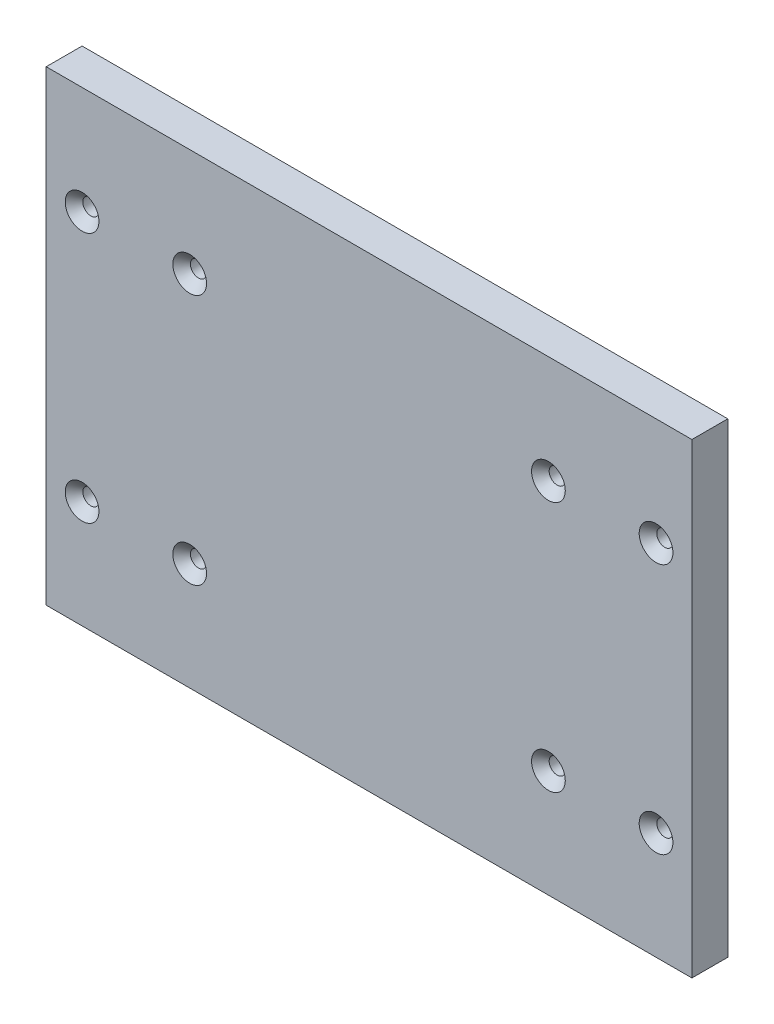
ISO-10303-21;
HEADER;
FILE_DESCRIPTION(('STEP AP214'),'2;1');
FILE_NAME('part.step','',(''),(''),'','','');
FILE_SCHEMA(('AUTOMOTIVE_DESIGN { 1 0 10303 214 1 1 1 1 }'));
ENDSEC;
DATA;
#1=APPLICATION_CONTEXT('core data for automotive mechanical design processes');
#2=APPLICATION_PROTOCOL_DEFINITION('international standard','automotive_design',2000,#1);
#3=PRODUCT_CONTEXT('',#1,'mechanical');
#4=PRODUCT('Part','Part','',(#3));
#5=PRODUCT_RELATED_PRODUCT_CATEGORY('part','',(#4));
#6=PRODUCT_DEFINITION_FORMATION('','',#4);
#7=PRODUCT_DEFINITION_CONTEXT('part definition',#1,'design');
#8=PRODUCT_DEFINITION('design','',#6,#7);
#9=PRODUCT_DEFINITION_SHAPE('','',#8);
#10=(LENGTH_UNIT() NAMED_UNIT(*) SI_UNIT(.MILLI.,.METRE.));
#11=(NAMED_UNIT(*) PLANE_ANGLE_UNIT() SI_UNIT($,.RADIAN.));
#12=(NAMED_UNIT(*) SI_UNIT($,.STERADIAN.) SOLID_ANGLE_UNIT());
#13=UNCERTAINTY_MEASURE_WITH_UNIT(LENGTH_MEASURE(1.E-05),#10,'distance_accuracy_value','');
#14=(GEOMETRIC_REPRESENTATION_CONTEXT(3) GLOBAL_UNCERTAINTY_ASSIGNED_CONTEXT((#13)) GLOBAL_UNIT_ASSIGNED_CONTEXT((#10,
#11,#12)) REPRESENTATION_CONTEXT('',''));
#15=CARTESIAN_POINT('',(0.,0.,0.));
#16=DIRECTION('',(0.,0.,1.));
#17=DIRECTION('',(1.,0.,0.));
#18=AXIS2_PLACEMENT_3D('',#15,#16,#17);
#19=CARTESIAN_POINT('',(0.,0.,10.));
#20=DIRECTION('',(1.,0.,0.));
#21=DIRECTION('',(0.,0.,-1.));
#22=AXIS2_PLACEMENT_3D('',#19,#20,#21);
#23=PLANE('',#22);
#24=DIRECTION('',(0.,-1.,0.));
#25=VECTOR('',#24,1.);
#26=CARTESIAN_POINT('',(0.,0.,0.));
#27=LINE('',#26,#25);
#28=CARTESIAN_POINT('',(0.,130.,0.));
#29=VERTEX_POINT('',#28);
#30=CARTESIAN_POINT('',(0.,0.,0.));
#31=VERTEX_POINT('',#30);
#32=EDGE_CURVE('E214',#29,#31,#27,.T.);
#33=ORIENTED_EDGE('',*,*,#32,.T.);
#34=DIRECTION('',(0.,0.,-1.));
#35=VECTOR('',#34,1.);
#36=CARTESIAN_POINT('',(0.,0.,10.));
#37=LINE('',#36,#35);
#38=CARTESIAN_POINT('',(0.,0.,10.));
#39=VERTEX_POINT('',#38);
#40=EDGE_CURVE('E11',#39,#31,#37,.T.);
#41=ORIENTED_EDGE('',*,*,#40,.F.);
#42=DIRECTION('',(0.,-1.,0.));
#43=VECTOR('',#42,1.);
#44=CARTESIAN_POINT('',(0.,0.,10.));
#45=LINE('',#44,#43);
#46=CARTESIAN_POINT('',(0.,130.,10.));
#47=VERTEX_POINT('',#46);
#48=EDGE_CURVE('E215',#47,#39,#45,.T.);
#49=ORIENTED_EDGE('',*,*,#48,.F.);
#50=DIRECTION('',(0.,0.,-1.));
#51=VECTOR('',#50,1.);
#52=CARTESIAN_POINT('',(0.,130.,10.));
#53=LINE('',#52,#51);
#54=EDGE_CURVE('E225',#47,#29,#53,.T.);
#55=ORIENTED_EDGE('',*,*,#54,.T.);
#56=EDGE_LOOP('',(#33,#41,#49,#55));
#57=FACE_BOUND('',#56,.T.);
#58=ADVANCED_FACE('F38',(#57),#23,.F.);
#59=CARTESIAN_POINT('',(0.,0.,10.));
#60=DIRECTION('',(0.,1.,0.));
#61=DIRECTION('',(0.,0.,1.));
#62=AXIS2_PLACEMENT_3D('',#59,#60,#61);
#63=PLANE('',#62);
#64=DIRECTION('',(1.,0.,0.));
#65=VECTOR('',#64,1.);
#66=CARTESIAN_POINT('',(0.,0.,0.));
#67=LINE('',#66,#65);
#68=CARTESIAN_POINT('',(180.,0.,0.));
#69=VERTEX_POINT('',#68);
#70=EDGE_CURVE('E229',#31,#69,#67,.T.);
#71=ORIENTED_EDGE('',*,*,#70,.T.);
#72=DIRECTION('',(0.,0.,-1.));
#73=VECTOR('',#72,1.);
#74=CARTESIAN_POINT('',(180.,0.,10.));
#75=LINE('',#74,#73);
#76=CARTESIAN_POINT('',(180.,0.,10.));
#77=VERTEX_POINT('',#76);
#78=EDGE_CURVE('E47',#77,#69,#75,.T.);
#79=ORIENTED_EDGE('',*,*,#78,.F.);
#80=DIRECTION('',(1.,0.,0.));
#81=VECTOR('',#80,1.);
#82=CARTESIAN_POINT('',(0.,0.,10.));
#83=LINE('',#82,#81);
#84=EDGE_CURVE('E86',#39,#77,#83,.T.);
#85=ORIENTED_EDGE('',*,*,#84,.F.);
#86=ORIENTED_EDGE('',*,*,#40,.T.);
#87=EDGE_LOOP('',(#71,#79,#85,#86));
#88=FACE_BOUND('',#87,.T.);
#89=ADVANCED_FACE('F260',(#88),#63,.F.);
#90=CARTESIAN_POINT('',(180.,0.,10.));
#91=DIRECTION('',(-1.,0.,0.));
#92=DIRECTION('',(0.,0.,1.));
#93=AXIS2_PLACEMENT_3D('',#90,#91,#92);
#94=PLANE('',#93);
#95=DIRECTION('',(0.,1.,0.));
#96=VECTOR('',#95,1.);
#97=CARTESIAN_POINT('',(180.,0.,0.));
#98=LINE('',#97,#96);
#99=CARTESIAN_POINT('',(180.,130.,0.));
#100=VERTEX_POINT('',#99);
#101=EDGE_CURVE('E73',#69,#100,#98,.T.);
#102=ORIENTED_EDGE('',*,*,#101,.T.);
#103=DIRECTION('',(0.,0.,-1.));
#104=VECTOR('',#103,1.);
#105=CARTESIAN_POINT('',(180.,130.,10.));
#106=LINE('',#105,#104);
#107=CARTESIAN_POINT('',(180.,130.,10.));
#108=VERTEX_POINT('',#107);
#109=EDGE_CURVE('E238',#108,#100,#106,.T.);
#110=ORIENTED_EDGE('',*,*,#109,.F.);
#111=DIRECTION('',(0.,1.,0.));
#112=VECTOR('',#111,1.);
#113=CARTESIAN_POINT('',(180.,0.,10.));
#114=LINE('',#113,#112);
#115=EDGE_CURVE('E220',#77,#108,#114,.T.);
#116=ORIENTED_EDGE('',*,*,#115,.F.);
#117=ORIENTED_EDGE('',*,*,#78,.T.);
#118=EDGE_LOOP('',(#102,#110,#116,#117));
#119=FACE_BOUND('',#118,.T.);
#120=ADVANCED_FACE('F242',(#119),#94,.F.);
#121=CARTESIAN_POINT('',(0.,130.,10.));
#122=DIRECTION('',(0.,-1.,0.));
#123=DIRECTION('',(0.,0.,-1.));
#124=AXIS2_PLACEMENT_3D('',#121,#122,#123);
#125=PLANE('',#124);
#126=DIRECTION('',(-1.,0.,0.));
#127=VECTOR('',#126,1.);
#128=CARTESIAN_POINT('',(0.,130.,0.));
#129=LINE('',#128,#127);
#130=EDGE_CURVE('E79',#100,#29,#129,.T.);
#131=ORIENTED_EDGE('',*,*,#130,.T.);
#132=ORIENTED_EDGE('',*,*,#54,.F.);
#133=DIRECTION('',(-1.,0.,0.));
#134=VECTOR('',#133,1.);
#135=CARTESIAN_POINT('',(0.,130.,10.));
#136=LINE('',#135,#134);
#137=EDGE_CURVE('E55',#108,#47,#136,.T.);
#138=ORIENTED_EDGE('',*,*,#137,.F.);
#139=ORIENTED_EDGE('',*,*,#109,.T.);
#140=EDGE_LOOP('',(#131,#132,#138,#139));
#141=FACE_BOUND('',#140,.T.);
#142=ADVANCED_FACE('F249',(#141),#125,.F.);
#143=CARTESIAN_POINT('',(0.,0.,10.));
#144=DIRECTION('',(0.,0.,-1.));
#145=DIRECTION('',(-1.,0.,0.));
#146=AXIS2_PLACEMENT_3D('',#143,#144,#145);
#147=PLANE('',#146);
#148=CARTESIAN_POINT('',(10.,100.,10.));
#149=DIRECTION('',(0.,0.,1.));
#150=DIRECTION('',(1.,0.,0.));
#151=AXIS2_PLACEMENT_3D('',#148,#149,#150);
#152=CIRCLE('',#151,4.7);
#153=CARTESIAN_POINT('',(14.7,100.,10.));
#154=VERTEX_POINT('',#153);
#155=EDGE_CURVE('E131',#154,#154,#152,.T.);
#156=ORIENTED_EDGE('',*,*,#155,.F.);
#157=EDGE_LOOP('',(#156));
#158=FACE_BOUND('',#157,.T.);
#159=CARTESIAN_POINT('',(40.,100.,10.));
#160=DIRECTION('',(0.,0.,1.));
#161=DIRECTION('',(1.,0.,0.));
#162=AXIS2_PLACEMENT_3D('',#159,#160,#161);
#163=CIRCLE('',#162,4.7);
#164=CARTESIAN_POINT('',(44.7,100.,10.));
#165=VERTEX_POINT('',#164);
#166=EDGE_CURVE('E122',#165,#165,#163,.T.);
#167=ORIENTED_EDGE('',*,*,#166,.F.);
#168=EDGE_LOOP('',(#167));
#169=FACE_BOUND('',#168,.T.);
#170=CARTESIAN_POINT('',(10.,30.,10.));
#171=DIRECTION('',(0.,0.,1.));
#172=DIRECTION('',(1.,0.,0.));
#173=AXIS2_PLACEMENT_3D('',#170,#171,#172);
#174=CIRCLE('',#173,4.7);
#175=CARTESIAN_POINT('',(14.7,30.,10.));
#176=VERTEX_POINT('',#175);
#177=EDGE_CURVE('E142',#176,#176,#174,.T.);
#178=ORIENTED_EDGE('',*,*,#177,.F.);
#179=EDGE_LOOP('',(#178));
#180=FACE_BOUND('',#179,.T.);
#181=CARTESIAN_POINT('',(40.,30.,10.));
#182=DIRECTION('',(0.,0.,1.));
#183=DIRECTION('',(1.,0.,0.));
#184=AXIS2_PLACEMENT_3D('',#181,#182,#183);
#185=CIRCLE('',#184,4.7);
#186=CARTESIAN_POINT('',(44.7,30.,10.));
#187=VERTEX_POINT('',#186);
#188=EDGE_CURVE('E154',#187,#187,#185,.T.);
#189=ORIENTED_EDGE('',*,*,#188,.F.);
#190=EDGE_LOOP('',(#189));
#191=FACE_BOUND('',#190,.T.);
#192=CARTESIAN_POINT('',(140.,100.,10.));
#193=DIRECTION('',(0.,0.,1.));
#194=DIRECTION('',(1.,0.,0.));
#195=AXIS2_PLACEMENT_3D('',#192,#193,#194);
#196=CIRCLE('',#195,4.70000000000001);
#197=CARTESIAN_POINT('',(144.7,100.,10.));
#198=VERTEX_POINT('',#197);
#199=EDGE_CURVE('E166',#198,#198,#196,.T.);
#200=ORIENTED_EDGE('',*,*,#199,.F.);
#201=EDGE_LOOP('',(#200));
#202=FACE_BOUND('',#201,.T.);
#203=CARTESIAN_POINT('',(170.,100.,10.));
#204=DIRECTION('',(0.,0.,1.));
#205=DIRECTION('',(1.,0.,0.));
#206=AXIS2_PLACEMENT_3D('',#203,#204,#205);
#207=CIRCLE('',#206,4.70000000000001);
#208=CARTESIAN_POINT('',(174.7,100.,10.));
#209=VERTEX_POINT('',#208);
#210=EDGE_CURVE('E178',#209,#209,#207,.T.);
#211=ORIENTED_EDGE('',*,*,#210,.F.);
#212=EDGE_LOOP('',(#211));
#213=FACE_BOUND('',#212,.T.);
#214=CARTESIAN_POINT('',(140.,30.,10.));
#215=DIRECTION('',(0.,0.,1.));
#216=DIRECTION('',(1.,0.,0.));
#217=AXIS2_PLACEMENT_3D('',#214,#215,#216);
#218=CIRCLE('',#217,4.70000000000001);
#219=CARTESIAN_POINT('',(144.7,30.,10.));
#220=VERTEX_POINT('',#219);
#221=EDGE_CURVE('E190',#220,#220,#218,.T.);
#222=ORIENTED_EDGE('',*,*,#221,.F.);
#223=EDGE_LOOP('',(#222));
#224=FACE_BOUND('',#223,.T.);
#225=CARTESIAN_POINT('',(170.,30.,10.));
#226=DIRECTION('',(0.,0.,1.));
#227=DIRECTION('',(1.,0.,0.));
#228=AXIS2_PLACEMENT_3D('',#225,#226,#227);
#229=CIRCLE('',#228,4.70000000000001);
#230=CARTESIAN_POINT('',(174.7,30.,10.));
#231=VERTEX_POINT('',#230);
#232=EDGE_CURVE('E202',#231,#231,#229,.T.);
#233=ORIENTED_EDGE('',*,*,#232,.F.);
#234=EDGE_LOOP('',(#233));
#235=FACE_BOUND('',#234,.T.);
#236=ORIENTED_EDGE('',*,*,#48,.T.);
#237=ORIENTED_EDGE('',*,*,#84,.T.);
#238=ORIENTED_EDGE('',*,*,#115,.T.);
#239=ORIENTED_EDGE('',*,*,#137,.T.);
#240=EDGE_LOOP('',(#236,#237,#238,#239));
#241=FACE_BOUND('',#240,.T.);
#242=ADVANCED_FACE('F251',(#158,#169,#180,#191,#202,#213,#224,#235,#241),#147,.F.);
#243=CARTESIAN_POINT('',(0.,0.,0.));
#244=DIRECTION('',(0.,0.,-1.));
#245=DIRECTION('',(-1.,0.,0.));
#246=AXIS2_PLACEMENT_3D('',#243,#244,#245);
#247=PLANE('',#246);
#248=ORIENTED_EDGE('',*,*,#32,.F.);
#249=ORIENTED_EDGE('',*,*,#130,.F.);
#250=ORIENTED_EDGE('',*,*,#101,.F.);
#251=ORIENTED_EDGE('',*,*,#70,.F.);
#252=EDGE_LOOP('',(#248,#249,#250,#251));
#253=FACE_BOUND('',#252,.T.);
#254=ADVANCED_FACE('F245',(#253),#247,.T.);
#255=CARTESIAN_POINT('',(170.,30.,4.));
#256=DIRECTION('',(0.,0.,1.));
#257=DIRECTION('',(1.,0.,0.));
#258=AXIS2_PLACEMENT_3D('',#255,#256,#257);
#259=CONICAL_SURFACE('',#258,2.25,1.02974425867665);
#260=CARTESIAN_POINT('',(170.,30.,2.64806360718799));
#261=VERTEX_POINT('',#260);
#262=VERTEX_LOOP('',#261);
#263=FACE_BOUND('',#262,.T.);
#264=CARTESIAN_POINT('',(170.,30.,4.));
#265=DIRECTION('',(0.,0.,1.));
#266=DIRECTION('',(1.,0.,0.));
#267=AXIS2_PLACEMENT_3D('',#264,#265,#266);
#268=CIRCLE('',#267,2.25);
#269=CARTESIAN_POINT('',(172.25,30.,4.));
#270=VERTEX_POINT('',#269);
#271=EDGE_CURVE('E210',#270,#270,#268,.T.);
#272=ORIENTED_EDGE('',*,*,#271,.T.);
#273=EDGE_LOOP('',(#272));
#274=FACE_BOUND('',#273,.T.);
#275=ADVANCED_FACE('F286',(#263,#274),#259,.F.);
#276=CARTESIAN_POINT('',(170.,30.,10.));
#277=DIRECTION('',(0.,0.,1.));
#278=DIRECTION('',(1.,0.,0.));
#279=AXIS2_PLACEMENT_3D('',#276,#277,#278);
#280=CYLINDRICAL_SURFACE('',#279,2.25);
#281=ORIENTED_EDGE('',*,*,#271,.F.);
#282=EDGE_LOOP('',(#281));
#283=FACE_BOUND('',#282,.T.);
#284=CARTESIAN_POINT('',(170.,30.,7.55));
#285=DIRECTION('',(0.,0.,1.));
#286=DIRECTION('',(1.,0.,0.));
#287=AXIS2_PLACEMENT_3D('',#284,#285,#286);
#288=CIRCLE('',#287,2.25);
#289=CARTESIAN_POINT('',(172.25,30.,7.55));
#290=VERTEX_POINT('',#289);
#291=EDGE_CURVE('E206',#290,#290,#288,.T.);
#292=ORIENTED_EDGE('',*,*,#291,.T.);
#293=EDGE_LOOP('',(#292));
#294=FACE_BOUND('',#293,.T.);
#295=ADVANCED_FACE('F297',(#283,#294),#280,.F.);
#296=CARTESIAN_POINT('',(170.,30.,10.));
#297=DIRECTION('',(0.,0.,1.));
#298=DIRECTION('',(1.,0.,0.));
#299=AXIS2_PLACEMENT_3D('',#296,#297,#298);
#300=CONICAL_SURFACE('',#299,4.70000000000001,0.78539816339745);
#301=ORIENTED_EDGE('',*,*,#291,.F.);
#302=EDGE_LOOP('',(#301));
#303=FACE_BOUND('',#302,.T.);
#304=ORIENTED_EDGE('',*,*,#232,.T.);
#305=EDGE_LOOP('',(#304));
#306=FACE_BOUND('',#305,.T.);
#307=ADVANCED_FACE('F307',(#303,#306),#300,.F.);
#308=CARTESIAN_POINT('',(140.,30.,4.));
#309=DIRECTION('',(0.,0.,1.));
#310=DIRECTION('',(1.,0.,0.));
#311=AXIS2_PLACEMENT_3D('',#308,#309,#310);
#312=CONICAL_SURFACE('',#311,2.25,1.02974425867665);
#313=CARTESIAN_POINT('',(140.,30.,2.64806360718799));
#314=VERTEX_POINT('',#313);
#315=VERTEX_LOOP('',#314);
#316=FACE_BOUND('',#315,.T.);
#317=CARTESIAN_POINT('',(140.,30.,4.));
#318=DIRECTION('',(0.,0.,1.));
#319=DIRECTION('',(1.,0.,0.));
#320=AXIS2_PLACEMENT_3D('',#317,#318,#319);
#321=CIRCLE('',#320,2.25);
#322=CARTESIAN_POINT('',(142.25,30.,4.));
#323=VERTEX_POINT('',#322);
#324=EDGE_CURVE('E198',#323,#323,#321,.T.);
#325=ORIENTED_EDGE('',*,*,#324,.T.);
#326=EDGE_LOOP('',(#325));
#327=FACE_BOUND('',#326,.T.);
#328=ADVANCED_FACE('F317',(#316,#327),#312,.F.);
#329=CARTESIAN_POINT('',(140.,30.,10.));
#330=DIRECTION('',(0.,0.,1.));
#331=DIRECTION('',(1.,0.,0.));
#332=AXIS2_PLACEMENT_3D('',#329,#330,#331);
#333=CYLINDRICAL_SURFACE('',#332,2.25);
#334=ORIENTED_EDGE('',*,*,#324,.F.);
#335=EDGE_LOOP('',(#334));
#336=FACE_BOUND('',#335,.T.);
#337=CARTESIAN_POINT('',(140.,30.,7.55));
#338=DIRECTION('',(0.,0.,1.));
#339=DIRECTION('',(1.,0.,0.));
#340=AXIS2_PLACEMENT_3D('',#337,#338,#339);
#341=CIRCLE('',#340,2.25);
#342=CARTESIAN_POINT('',(142.25,30.,7.55));
#343=VERTEX_POINT('',#342);
#344=EDGE_CURVE('E194',#343,#343,#341,.T.);
#345=ORIENTED_EDGE('',*,*,#344,.T.);
#346=EDGE_LOOP('',(#345));
#347=FACE_BOUND('',#346,.T.);
#348=ADVANCED_FACE('F327',(#336,#347),#333,.F.);
#349=CARTESIAN_POINT('',(140.,30.,10.));
#350=DIRECTION('',(0.,0.,1.));
#351=DIRECTION('',(1.,0.,0.));
#352=AXIS2_PLACEMENT_3D('',#349,#350,#351);
#353=CONICAL_SURFACE('',#352,4.70000000000001,0.78539816339745);
#354=ORIENTED_EDGE('',*,*,#344,.F.);
#355=EDGE_LOOP('',(#354));
#356=FACE_BOUND('',#355,.T.);
#357=ORIENTED_EDGE('',*,*,#221,.T.);
#358=EDGE_LOOP('',(#357));
#359=FACE_BOUND('',#358,.T.);
#360=ADVANCED_FACE('F337',(#356,#359),#353,.F.);
#361=CARTESIAN_POINT('',(170.,100.,4.));
#362=DIRECTION('',(0.,0.,1.));
#363=DIRECTION('',(1.,0.,0.));
#364=AXIS2_PLACEMENT_3D('',#361,#362,#363);
#365=CONICAL_SURFACE('',#364,2.25,1.02974425867665);
#366=CARTESIAN_POINT('',(170.,100.,2.64806360718799));
#367=VERTEX_POINT('',#366);
#368=VERTEX_LOOP('',#367);
#369=FACE_BOUND('',#368,.T.);
#370=CARTESIAN_POINT('',(170.,100.,4.));
#371=DIRECTION('',(0.,0.,1.));
#372=DIRECTION('',(1.,0.,0.));
#373=AXIS2_PLACEMENT_3D('',#370,#371,#372);
#374=CIRCLE('',#373,2.25);
#375=CARTESIAN_POINT('',(172.25,100.,4.));
#376=VERTEX_POINT('',#375);
#377=EDGE_CURVE('E186',#376,#376,#374,.T.);
#378=ORIENTED_EDGE('',*,*,#377,.T.);
#379=EDGE_LOOP('',(#378));
#380=FACE_BOUND('',#379,.T.);
#381=ADVANCED_FACE('F347',(#369,#380),#365,.F.);
#382=CARTESIAN_POINT('',(170.,100.,10.));
#383=DIRECTION('',(0.,0.,1.));
#384=DIRECTION('',(1.,0.,0.));
#385=AXIS2_PLACEMENT_3D('',#382,#383,#384);
#386=CYLINDRICAL_SURFACE('',#385,2.25);
#387=ORIENTED_EDGE('',*,*,#377,.F.);
#388=EDGE_LOOP('',(#387));
#389=FACE_BOUND('',#388,.T.);
#390=CARTESIAN_POINT('',(170.,100.,7.55));
#391=DIRECTION('',(0.,0.,1.));
#392=DIRECTION('',(1.,0.,0.));
#393=AXIS2_PLACEMENT_3D('',#390,#391,#392);
#394=CIRCLE('',#393,2.25);
#395=CARTESIAN_POINT('',(172.25,100.,7.55));
#396=VERTEX_POINT('',#395);
#397=EDGE_CURVE('E182',#396,#396,#394,.T.);
#398=ORIENTED_EDGE('',*,*,#397,.T.);
#399=EDGE_LOOP('',(#398));
#400=FACE_BOUND('',#399,.T.);
#401=ADVANCED_FACE('F357',(#389,#400),#386,.F.);
#402=CARTESIAN_POINT('',(170.,100.,10.));
#403=DIRECTION('',(0.,0.,1.));
#404=DIRECTION('',(1.,0.,0.));
#405=AXIS2_PLACEMENT_3D('',#402,#403,#404);
#406=CONICAL_SURFACE('',#405,4.70000000000001,0.78539816339745);
#407=ORIENTED_EDGE('',*,*,#397,.F.);
#408=EDGE_LOOP('',(#407));
#409=FACE_BOUND('',#408,.T.);
#410=ORIENTED_EDGE('',*,*,#210,.T.);
#411=EDGE_LOOP('',(#410));
#412=FACE_BOUND('',#411,.T.);
#413=ADVANCED_FACE('F367',(#409,#412),#406,.F.);
#414=CARTESIAN_POINT('',(140.,100.,4.));
#415=DIRECTION('',(0.,0.,1.));
#416=DIRECTION('',(1.,0.,0.));
#417=AXIS2_PLACEMENT_3D('',#414,#415,#416);
#418=CONICAL_SURFACE('',#417,2.25,1.02974425867665);
#419=CARTESIAN_POINT('',(140.,100.,2.64806360718799));
#420=VERTEX_POINT('',#419);
#421=VERTEX_LOOP('',#420);
#422=FACE_BOUND('',#421,.T.);
#423=CARTESIAN_POINT('',(140.,100.,4.));
#424=DIRECTION('',(0.,0.,1.));
#425=DIRECTION('',(1.,0.,0.));
#426=AXIS2_PLACEMENT_3D('',#423,#424,#425);
#427=CIRCLE('',#426,2.25);
#428=CARTESIAN_POINT('',(142.25,100.,4.));
#429=VERTEX_POINT('',#428);
#430=EDGE_CURVE('E174',#429,#429,#427,.T.);
#431=ORIENTED_EDGE('',*,*,#430,.T.);
#432=EDGE_LOOP('',(#431));
#433=FACE_BOUND('',#432,.T.);
#434=ADVANCED_FACE('F377',(#422,#433),#418,.F.);
#435=CARTESIAN_POINT('',(140.,100.,10.));
#436=DIRECTION('',(0.,0.,1.));
#437=DIRECTION('',(1.,0.,0.));
#438=AXIS2_PLACEMENT_3D('',#435,#436,#437);
#439=CYLINDRICAL_SURFACE('',#438,2.25);
#440=ORIENTED_EDGE('',*,*,#430,.F.);
#441=EDGE_LOOP('',(#440));
#442=FACE_BOUND('',#441,.T.);
#443=CARTESIAN_POINT('',(140.,100.,7.55));
#444=DIRECTION('',(0.,0.,1.));
#445=DIRECTION('',(1.,0.,0.));
#446=AXIS2_PLACEMENT_3D('',#443,#444,#445);
#447=CIRCLE('',#446,2.25);
#448=CARTESIAN_POINT('',(142.25,100.,7.55));
#449=VERTEX_POINT('',#448);
#450=EDGE_CURVE('E170',#449,#449,#447,.T.);
#451=ORIENTED_EDGE('',*,*,#450,.T.);
#452=EDGE_LOOP('',(#451));
#453=FACE_BOUND('',#452,.T.);
#454=ADVANCED_FACE('F387',(#442,#453),#439,.F.);
#455=CARTESIAN_POINT('',(140.,100.,10.));
#456=DIRECTION('',(0.,0.,1.));
#457=DIRECTION('',(1.,0.,0.));
#458=AXIS2_PLACEMENT_3D('',#455,#456,#457);
#459=CONICAL_SURFACE('',#458,4.70000000000001,0.78539816339745);
#460=ORIENTED_EDGE('',*,*,#450,.F.);
#461=EDGE_LOOP('',(#460));
#462=FACE_BOUND('',#461,.T.);
#463=ORIENTED_EDGE('',*,*,#199,.T.);
#464=EDGE_LOOP('',(#463));
#465=FACE_BOUND('',#464,.T.);
#466=ADVANCED_FACE('F397',(#462,#465),#459,.F.);
#467=CARTESIAN_POINT('',(40.,30.,4.));
#468=DIRECTION('',(0.,0.,1.));
#469=DIRECTION('',(1.,0.,0.));
#470=AXIS2_PLACEMENT_3D('',#467,#468,#469);
#471=CONICAL_SURFACE('',#470,2.25,1.02974425867665);
#472=CARTESIAN_POINT('',(40.,30.,2.64806360718799));
#473=VERTEX_POINT('',#472);
#474=VERTEX_LOOP('',#473);
#475=FACE_BOUND('',#474,.T.);
#476=CARTESIAN_POINT('',(40.,30.,4.));
#477=DIRECTION('',(0.,0.,1.));
#478=DIRECTION('',(1.,0.,0.));
#479=AXIS2_PLACEMENT_3D('',#476,#477,#478);
#480=CIRCLE('',#479,2.25);
#481=CARTESIAN_POINT('',(42.25,30.,4.));
#482=VERTEX_POINT('',#481);
#483=EDGE_CURVE('E162',#482,#482,#480,.T.);
#484=ORIENTED_EDGE('',*,*,#483,.T.);
#485=EDGE_LOOP('',(#484));
#486=FACE_BOUND('',#485,.T.);
#487=ADVANCED_FACE('F407',(#475,#486),#471,.F.);
#488=CARTESIAN_POINT('',(40.,30.,10.));
#489=DIRECTION('',(0.,0.,1.));
#490=DIRECTION('',(1.,0.,0.));
#491=AXIS2_PLACEMENT_3D('',#488,#489,#490);
#492=CYLINDRICAL_SURFACE('',#491,2.25);
#493=ORIENTED_EDGE('',*,*,#483,.F.);
#494=EDGE_LOOP('',(#493));
#495=FACE_BOUND('',#494,.T.);
#496=CARTESIAN_POINT('',(40.,30.,7.55));
#497=DIRECTION('',(0.,0.,1.));
#498=DIRECTION('',(1.,0.,0.));
#499=AXIS2_PLACEMENT_3D('',#496,#497,#498);
#500=CIRCLE('',#499,2.25);
#501=CARTESIAN_POINT('',(42.25,30.,7.55));
#502=VERTEX_POINT('',#501);
#503=EDGE_CURVE('E158',#502,#502,#500,.T.);
#504=ORIENTED_EDGE('',*,*,#503,.T.);
#505=EDGE_LOOP('',(#504));
#506=FACE_BOUND('',#505,.T.);
#507=ADVANCED_FACE('F417',(#495,#506),#492,.F.);
#508=CARTESIAN_POINT('',(40.,30.,10.));
#509=DIRECTION('',(0.,0.,1.));
#510=DIRECTION('',(1.,0.,0.));
#511=AXIS2_PLACEMENT_3D('',#508,#509,#510);
#512=CONICAL_SURFACE('',#511,4.7,0.785398163397448);
#513=ORIENTED_EDGE('',*,*,#503,.F.);
#514=EDGE_LOOP('',(#513));
#515=FACE_BOUND('',#514,.T.);
#516=ORIENTED_EDGE('',*,*,#188,.T.);
#517=EDGE_LOOP('',(#516));
#518=FACE_BOUND('',#517,.T.);
#519=ADVANCED_FACE('F427',(#515,#518),#512,.F.);
#520=CARTESIAN_POINT('',(10.,30.,4.));
#521=DIRECTION('',(0.,0.,1.));
#522=DIRECTION('',(1.,0.,0.));
#523=AXIS2_PLACEMENT_3D('',#520,#521,#522);
#524=CONICAL_SURFACE('',#523,2.25,1.02974425867665);
#525=CARTESIAN_POINT('',(10.,30.,2.64806360718799));
#526=VERTEX_POINT('',#525);
#527=VERTEX_LOOP('',#526);
#528=FACE_BOUND('',#527,.T.);
#529=CARTESIAN_POINT('',(10.,30.,4.));
#530=DIRECTION('',(0.,0.,1.));
#531=DIRECTION('',(1.,0.,0.));
#532=AXIS2_PLACEMENT_3D('',#529,#530,#531);
#533=CIRCLE('',#532,2.25);
#534=CARTESIAN_POINT('',(12.25,30.,4.));
#535=VERTEX_POINT('',#534);
#536=EDGE_CURVE('E150',#535,#535,#533,.T.);
#537=ORIENTED_EDGE('',*,*,#536,.T.);
#538=EDGE_LOOP('',(#537));
#539=FACE_BOUND('',#538,.T.);
#540=ADVANCED_FACE('F437',(#528,#539),#524,.F.);
#541=CARTESIAN_POINT('',(10.,30.,10.));
#542=DIRECTION('',(0.,0.,1.));
#543=DIRECTION('',(1.,0.,0.));
#544=AXIS2_PLACEMENT_3D('',#541,#542,#543);
#545=CYLINDRICAL_SURFACE('',#544,2.25);
#546=ORIENTED_EDGE('',*,*,#536,.F.);
#547=EDGE_LOOP('',(#546));
#548=FACE_BOUND('',#547,.T.);
#549=CARTESIAN_POINT('',(10.,30.,7.55));
#550=DIRECTION('',(0.,0.,1.));
#551=DIRECTION('',(1.,0.,0.));
#552=AXIS2_PLACEMENT_3D('',#549,#550,#551);
#553=CIRCLE('',#552,2.25);
#554=CARTESIAN_POINT('',(12.25,30.,7.55));
#555=VERTEX_POINT('',#554);
#556=EDGE_CURVE('E146',#555,#555,#553,.T.);
#557=ORIENTED_EDGE('',*,*,#556,.T.);
#558=EDGE_LOOP('',(#557));
#559=FACE_BOUND('',#558,.T.);
#560=ADVANCED_FACE('F447',(#548,#559),#545,.F.);
#561=CARTESIAN_POINT('',(10.,30.,10.));
#562=DIRECTION('',(0.,0.,1.));
#563=DIRECTION('',(1.,0.,0.));
#564=AXIS2_PLACEMENT_3D('',#561,#562,#563);
#565=CONICAL_SURFACE('',#564,4.7,0.785398163397448);
#566=ORIENTED_EDGE('',*,*,#556,.F.);
#567=EDGE_LOOP('',(#566));
#568=FACE_BOUND('',#567,.T.);
#569=ORIENTED_EDGE('',*,*,#177,.T.);
#570=EDGE_LOOP('',(#569));
#571=FACE_BOUND('',#570,.T.);
#572=ADVANCED_FACE('F457',(#568,#571),#565,.F.);
#573=CARTESIAN_POINT('',(40.,100.,4.));
#574=DIRECTION('',(0.,0.,1.));
#575=DIRECTION('',(1.,0.,0.));
#576=AXIS2_PLACEMENT_3D('',#573,#574,#575);
#577=CONICAL_SURFACE('',#576,2.25,1.02974425867665);
#578=CARTESIAN_POINT('',(40.,100.,2.64806360718799));
#579=VERTEX_POINT('',#578);
#580=VERTEX_LOOP('',#579);
#581=FACE_BOUND('',#580,.T.);
#582=CARTESIAN_POINT('',(40.,100.,4.));
#583=DIRECTION('',(0.,0.,1.));
#584=DIRECTION('',(1.,0.,0.));
#585=AXIS2_PLACEMENT_3D('',#582,#583,#584);
#586=CIRCLE('',#585,2.25);
#587=CARTESIAN_POINT('',(42.25,100.,4.));
#588=VERTEX_POINT('',#587);
#589=EDGE_CURVE('E138',#588,#588,#586,.T.);
#590=ORIENTED_EDGE('',*,*,#589,.T.);
#591=EDGE_LOOP('',(#590));
#592=FACE_BOUND('',#591,.T.);
#593=ADVANCED_FACE('F467',(#581,#592),#577,.F.);
#594=CARTESIAN_POINT('',(40.,100.,10.));
#595=DIRECTION('',(0.,0.,1.));
#596=DIRECTION('',(1.,0.,0.));
#597=AXIS2_PLACEMENT_3D('',#594,#595,#596);
#598=CYLINDRICAL_SURFACE('',#597,2.25);
#599=ORIENTED_EDGE('',*,*,#589,.F.);
#600=EDGE_LOOP('',(#599));
#601=FACE_BOUND('',#600,.T.);
#602=CARTESIAN_POINT('',(40.,100.,7.55));
#603=DIRECTION('',(0.,0.,1.));
#604=DIRECTION('',(1.,0.,0.));
#605=AXIS2_PLACEMENT_3D('',#602,#603,#604);
#606=CIRCLE('',#605,2.25);
#607=CARTESIAN_POINT('',(42.25,100.,7.55));
#608=VERTEX_POINT('',#607);
#609=EDGE_CURVE('E128',#608,#608,#606,.T.);
#610=ORIENTED_EDGE('',*,*,#609,.T.);
#611=EDGE_LOOP('',(#610));
#612=FACE_BOUND('',#611,.T.);
#613=ADVANCED_FACE('F477',(#601,#612),#598,.F.);
#614=CARTESIAN_POINT('',(40.,100.,10.));
#615=DIRECTION('',(0.,0.,1.));
#616=DIRECTION('',(1.,0.,0.));
#617=AXIS2_PLACEMENT_3D('',#614,#615,#616);
#618=CONICAL_SURFACE('',#617,4.7,0.785398163397447);
#619=ORIENTED_EDGE('',*,*,#609,.F.);
#620=EDGE_LOOP('',(#619));
#621=FACE_BOUND('',#620,.T.);
#622=ORIENTED_EDGE('',*,*,#166,.T.);
#623=EDGE_LOOP('',(#622));
#624=FACE_BOUND('',#623,.T.);
#625=ADVANCED_FACE('F115',(#621,#624),#618,.F.);
#626=CARTESIAN_POINT('',(10.,100.,4.));
#627=DIRECTION('',(0.,0.,1.));
#628=DIRECTION('',(1.,0.,0.));
#629=AXIS2_PLACEMENT_3D('',#626,#627,#628);
#630=CONICAL_SURFACE('',#629,2.25,1.02974425867665);
#631=CARTESIAN_POINT('',(10.,100.,2.64806360718799));
#632=VERTEX_POINT('',#631);
#633=VERTEX_LOOP('',#632);
#634=FACE_BOUND('',#633,.T.);
#635=CARTESIAN_POINT('',(10.,100.,4.));
#636=DIRECTION('',(0.,0.,1.));
#637=DIRECTION('',(1.,0.,0.));
#638=AXIS2_PLACEMENT_3D('',#635,#636,#637);
#639=CIRCLE('',#638,2.25);
#640=CARTESIAN_POINT('',(12.25,100.,4.));
#641=VERTEX_POINT('',#640);
#642=EDGE_CURVE('E119',#641,#641,#639,.T.);
#643=ORIENTED_EDGE('',*,*,#642,.T.);
#644=EDGE_LOOP('',(#643));
#645=FACE_BOUND('',#644,.T.);
#646=ADVANCED_FACE('F111',(#634,#645),#630,.F.);
#647=CARTESIAN_POINT('',(10.,100.,10.));
#648=DIRECTION('',(0.,0.,1.));
#649=DIRECTION('',(1.,0.,0.));
#650=AXIS2_PLACEMENT_3D('',#647,#648,#649);
#651=CYLINDRICAL_SURFACE('',#650,2.25);
#652=ORIENTED_EDGE('',*,*,#642,.F.);
#653=EDGE_LOOP('',(#652));
#654=FACE_BOUND('',#653,.T.);
#655=CARTESIAN_POINT('',(10.,100.,7.55));
#656=DIRECTION('',(0.,0.,1.));
#657=DIRECTION('',(1.,0.,0.));
#658=AXIS2_PLACEMENT_3D('',#655,#656,#657);
#659=CIRCLE('',#658,2.25);
#660=CARTESIAN_POINT('',(12.25,100.,7.55));
#661=VERTEX_POINT('',#660);
#662=EDGE_CURVE('E123',#661,#661,#659,.T.);
#663=ORIENTED_EDGE('',*,*,#662,.T.);
#664=EDGE_LOOP('',(#663));
#665=FACE_BOUND('',#664,.T.);
#666=ADVANCED_FACE('F114',(#654,#665),#651,.F.);
#667=CARTESIAN_POINT('',(10.,100.,10.));
#668=DIRECTION('',(0.,0.,1.));
#669=DIRECTION('',(1.,0.,0.));
#670=AXIS2_PLACEMENT_3D('',#667,#668,#669);
#671=CONICAL_SURFACE('',#670,4.7,0.785398163397448);
#672=ORIENTED_EDGE('',*,*,#662,.F.);
#673=EDGE_LOOP('',(#672));
#674=FACE_BOUND('',#673,.T.);
#675=ORIENTED_EDGE('',*,*,#155,.T.);
#676=EDGE_LOOP('',(#675));
#677=FACE_BOUND('',#676,.T.);
#678=ADVANCED_FACE('F511',(#674,#677),#671,.F.);
#679=CLOSED_SHELL('',(#58,#89,#120,#142,#242,#254,#275,#295,#307,#328,#348,#360,#381,#401,#413,
#434,#454,#466,#487,#507,#519,#540,#560,#572,#593,#613,#625,#646,#666,#678));
#680=MANIFOLD_SOLID_BREP('B2',#679);
#681=ADVANCED_BREP_SHAPE_REPRESENTATION('',(#18,#680),#14);
#682=SHAPE_DEFINITION_REPRESENTATION(#9,#681);
ENDSEC;
END-ISO-10303-21;
